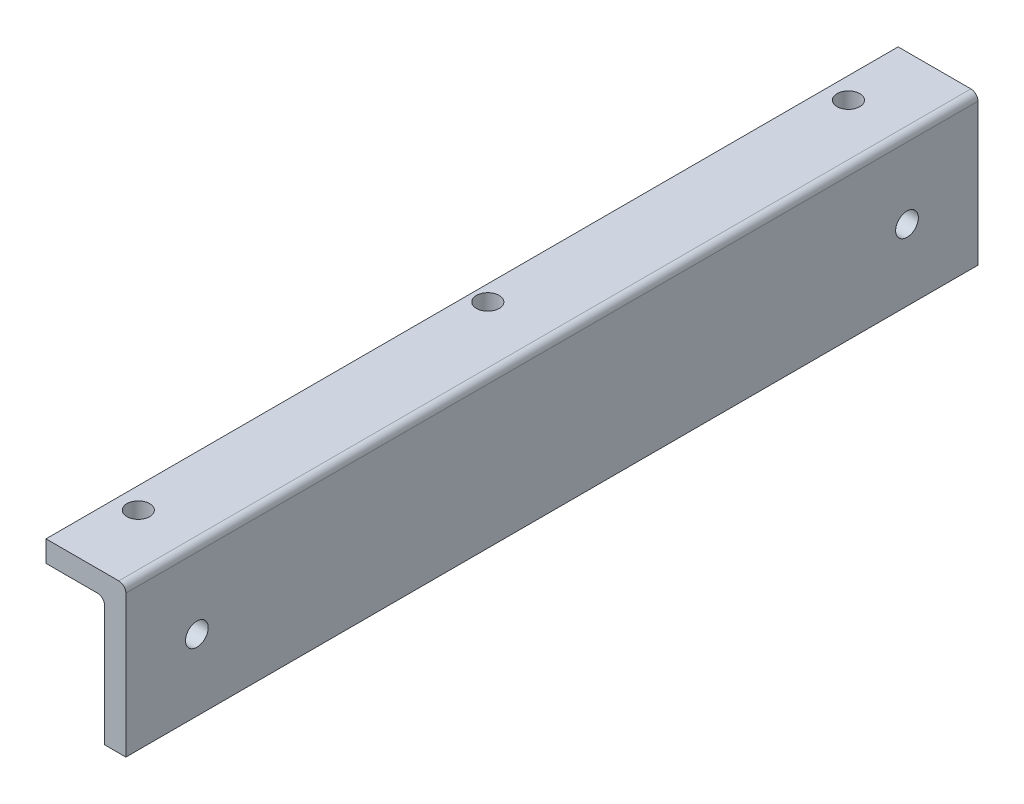
ISO-10303-21;
HEADER;
FILE_DESCRIPTION(('STEP AP214'),'2;1');
FILE_NAME('part.step','',(''),(''),'','','');
FILE_SCHEMA(('AUTOMOTIVE_DESIGN { 1 0 10303 214 1 1 1 1 }'));
ENDSEC;
DATA;
#1=APPLICATION_CONTEXT('core data for automotive mechanical design processes');
#2=APPLICATION_PROTOCOL_DEFINITION('international standard','automotive_design',2000,#1);
#3=PRODUCT_CONTEXT('',#1,'mechanical');
#4=PRODUCT('Part','Part','',(#3));
#5=PRODUCT_RELATED_PRODUCT_CATEGORY('part','',(#4));
#6=PRODUCT_DEFINITION_FORMATION('','',#4);
#7=PRODUCT_DEFINITION_CONTEXT('part definition',#1,'design');
#8=PRODUCT_DEFINITION('design','',#6,#7);
#9=PRODUCT_DEFINITION_SHAPE('','',#8);
#10=(LENGTH_UNIT() NAMED_UNIT(*) SI_UNIT(.MILLI.,.METRE.));
#11=(NAMED_UNIT(*) PLANE_ANGLE_UNIT() SI_UNIT($,.RADIAN.));
#12=(NAMED_UNIT(*) SI_UNIT($,.STERADIAN.) SOLID_ANGLE_UNIT());
#13=UNCERTAINTY_MEASURE_WITH_UNIT(LENGTH_MEASURE(1.E-05),#10,'distance_accuracy_value','');
#14=(GEOMETRIC_REPRESENTATION_CONTEXT(3) GLOBAL_UNCERTAINTY_ASSIGNED_CONTEXT((#13)) GLOBAL_UNIT_ASSIGNED_CONTEXT((#10,
#11,#12)) REPRESENTATION_CONTEXT('',''));
#15=CARTESIAN_POINT('',(0.,0.,0.));
#16=DIRECTION('',(0.,0.,1.));
#17=DIRECTION('',(1.,0.,0.));
#18=AXIS2_PLACEMENT_3D('',#15,#16,#17);
#19=CARTESIAN_POINT('',(-16.7448502616641,-0.762431653722327,60.));
#20=DIRECTION('',(0.,1.,0.));
#21=DIRECTION('',(0.,0.,1.));
#22=AXIS2_PLACEMENT_3D('',#19,#20,#21);
#23=PLANE('',#22);
#24=DIRECTION('',(1.,0.,0.));
#25=VECTOR('',#24,1.);
#26=CARTESIAN_POINT('',(-16.7448502616641,-0.762431653722327,-60.));
#27=LINE('',#26,#25);
#28=CARTESIAN_POINT('',(-16.7448502616641,-0.762431653722327,-60.));
#29=VERTEX_POINT('',#28);
#30=CARTESIAN_POINT('',(-13.7448502616641,-0.762431653722327,-60.));
#31=VERTEX_POINT('',#30);
#32=EDGE_CURVE('E137',#29,#31,#27,.T.);
#33=ORIENTED_EDGE('',*,*,#32,.T.);
#34=DIRECTION('',(0.,0.,-1.));
#35=VECTOR('',#34,1.);
#36=CARTESIAN_POINT('',(-13.7448502616641,-0.762431653722327,60.));
#37=LINE('',#36,#35);
#38=CARTESIAN_POINT('',(-13.7448502616641,-0.762431653722327,60.));
#39=VERTEX_POINT('',#38);
#40=EDGE_CURVE('E116',#39,#31,#37,.T.);
#41=ORIENTED_EDGE('',*,*,#40,.F.);
#42=DIRECTION('',(1.,0.,0.));
#43=VECTOR('',#42,1.);
#44=CARTESIAN_POINT('',(-16.7448502616641,-0.762431653722327,60.));
#45=LINE('',#44,#43);
#46=CARTESIAN_POINT('',(-16.7448502616641,-0.762431653722327,60.));
#47=VERTEX_POINT('',#46);
#48=EDGE_CURVE('E124',#47,#39,#45,.T.);
#49=ORIENTED_EDGE('',*,*,#48,.F.);
#50=DIRECTION('',(0.,0.,-1.));
#51=VECTOR('',#50,1.);
#52=CARTESIAN_POINT('',(-16.7448502616641,-0.762431653722327,60.));
#53=LINE('',#52,#51);
#54=EDGE_CURVE('E180',#47,#29,#53,.T.);
#55=ORIENTED_EDGE('',*,*,#54,.T.);
#56=EDGE_LOOP('',(#33,#41,#49,#55));
#57=FACE_BOUND('',#56,.T.);
#58=ADVANCED_FACE('F45',(#57),#23,.F.);
#59=CARTESIAN_POINT('',(-13.7448502616641,-0.762431653722327,60.));
#60=DIRECTION('',(-1.,0.,0.));
#61=DIRECTION('',(0.,0.,1.));
#62=AXIS2_PLACEMENT_3D('',#59,#60,#61);
#63=PLANE('',#62);
#64=CARTESIAN_POINT('',(-13.7448502616641,9.23756834627768,50.));
#65=DIRECTION('',(-1.,0.,0.));
#66=DIRECTION('',(0.,0.,1.));
#67=AXIS2_PLACEMENT_3D('',#64,#65,#66);
#68=CIRCLE('',#67,1.6);
#69=CARTESIAN_POINT('',(-13.7448502616641,9.23756834627768,51.6));
#70=VERTEX_POINT('',#69);
#71=EDGE_CURVE('E200',#70,#70,#68,.T.);
#72=ORIENTED_EDGE('',*,*,#71,.T.);
#73=EDGE_LOOP('',(#72));
#74=FACE_BOUND('',#73,.T.);
#75=CARTESIAN_POINT('',(-13.7448502616641,9.23756834627768,-50.));
#76=DIRECTION('',(-1.,0.,0.));
#77=DIRECTION('',(0.,0.,1.));
#78=AXIS2_PLACEMENT_3D('',#75,#76,#77);
#79=CIRCLE('',#78,1.6);
#80=CARTESIAN_POINT('',(-13.7448502616641,9.23756834627768,-48.4));
#81=VERTEX_POINT('',#80);
#82=EDGE_CURVE('E213',#81,#81,#79,.T.);
#83=ORIENTED_EDGE('',*,*,#82,.T.);
#84=EDGE_LOOP('',(#83));
#85=FACE_BOUND('',#84,.T.);
#86=DIRECTION('',(0.,1.,0.));
#87=VECTOR('',#86,1.);
#88=CARTESIAN_POINT('',(-13.7448502616641,-0.762431653722327,-60.));
#89=LINE('',#88,#87);
#90=CARTESIAN_POINT('',(-13.7448502616641,19.2375683462777,-60.));
#91=VERTEX_POINT('',#90);
#92=EDGE_CURVE('E193',#31,#91,#89,.T.);
#93=ORIENTED_EDGE('',*,*,#92,.T.);
#94=DIRECTION('',(0.,0.,-1.));
#95=VECTOR('',#94,1.);
#96=CARTESIAN_POINT('',(-13.7448502616641,19.2375683462777,60.));
#97=LINE('',#96,#95);
#98=CARTESIAN_POINT('',(-13.7448502616641,19.2375683462777,60.));
#99=VERTEX_POINT('',#98);
#100=EDGE_CURVE('E119',#91,#99,#97,.F.);
#101=ORIENTED_EDGE('',*,*,#100,.T.);
#102=DIRECTION('',(0.,1.,0.));
#103=VECTOR('',#102,1.);
#104=CARTESIAN_POINT('',(-13.7448502616641,-0.762431653722327,60.));
#105=LINE('',#104,#103);
#106=EDGE_CURVE('E111',#39,#99,#105,.T.);
#107=ORIENTED_EDGE('',*,*,#106,.F.);
#108=ORIENTED_EDGE('',*,*,#40,.T.);
#109=EDGE_LOOP('',(#93,#101,#107,#108));
#110=FACE_BOUND('',#109,.T.);
#111=ADVANCED_FACE('F114',(#74,#85,#110),#63,.F.);
#112=CARTESIAN_POINT('',(-13.7448502616641,20.2375683462777,60.));
#113=DIRECTION('',(0.,-1.,0.));
#114=DIRECTION('',(1.,0.,0.));
#115=AXIS2_PLACEMENT_3D('',#112,#113,#114);
#116=PLANE('',#115);
#117=CARTESIAN_POINT('',(-21.9948502616641,20.2375683462777,-50.));
#118=DIRECTION('',(0.,-1.,0.));
#119=DIRECTION('',(1.,0.,0.));
#120=AXIS2_PLACEMENT_3D('',#117,#118,#119);
#121=CIRCLE('',#120,1.6);
#122=CARTESIAN_POINT('',(-20.3948502616641,20.2375683462777,-50.));
#123=VERTEX_POINT('',#122);
#124=EDGE_CURVE('E222',#123,#123,#121,.T.);
#125=ORIENTED_EDGE('',*,*,#124,.T.);
#126=EDGE_LOOP('',(#125));
#127=FACE_BOUND('',#126,.T.);
#128=CARTESIAN_POINT('',(-21.9948502616641,20.2375683462777,50.));
#129=DIRECTION('',(0.,-1.,0.));
#130=DIRECTION('',(1.,0.,0.));
#131=AXIS2_PLACEMENT_3D('',#128,#129,#130);
#132=CIRCLE('',#131,1.6);
#133=CARTESIAN_POINT('',(-20.3948502616641,20.2375683462777,50.));
#134=VERTEX_POINT('',#133);
#135=EDGE_CURVE('E229',#134,#134,#132,.T.);
#136=ORIENTED_EDGE('',*,*,#135,.T.);
#137=EDGE_LOOP('',(#136));
#138=FACE_BOUND('',#137,.T.);
#139=CARTESIAN_POINT('',(-22.7777333050218,20.2375683462777,0.));
#140=DIRECTION('',(0.,-1.,0.));
#141=DIRECTION('',(1.,0.,0.));
#142=AXIS2_PLACEMENT_3D('',#139,#140,#141);
#143=CIRCLE('',#142,1.6);
#144=CARTESIAN_POINT('',(-21.1777333050218,20.2375683462777,0.));
#145=VERTEX_POINT('',#144);
#146=EDGE_CURVE('E233',#145,#145,#143,.T.);
#147=ORIENTED_EDGE('',*,*,#146,.T.);
#148=EDGE_LOOP('',(#147));
#149=FACE_BOUND('',#148,.T.);
#150=DIRECTION('',(-1.,0.,0.));
#151=VECTOR('',#150,1.);
#152=CARTESIAN_POINT('',(-13.7448502616641,20.2375683462777,60.));
#153=LINE('',#152,#151);
#154=CARTESIAN_POINT('',(-14.7448502616641,20.2375683462777,60.));
#155=VERTEX_POINT('',#154);
#156=CARTESIAN_POINT('',(-24.9948502616641,20.2375683462777,60.));
#157=VERTEX_POINT('',#156);
#158=EDGE_CURVE('E123',#155,#157,#153,.T.);
#159=ORIENTED_EDGE('',*,*,#158,.F.);
#160=DIRECTION('',(0.,0.,-1.));
#161=VECTOR('',#160,1.);
#162=CARTESIAN_POINT('',(-14.7448502616641,20.2375683462777,60.));
#163=LINE('',#162,#161);
#164=CARTESIAN_POINT('',(-14.7448502616641,20.2375683462777,-60.));
#165=VERTEX_POINT('',#164);
#166=EDGE_CURVE('E139',#155,#165,#163,.T.);
#167=ORIENTED_EDGE('',*,*,#166,.T.);
#168=DIRECTION('',(-1.,0.,0.));
#169=VECTOR('',#168,1.);
#170=CARTESIAN_POINT('',(-13.7448502616641,20.2375683462777,-60.));
#171=LINE('',#170,#169);
#172=CARTESIAN_POINT('',(-24.9948502616641,20.2375683462777,-60.));
#173=VERTEX_POINT('',#172);
#174=EDGE_CURVE('E190',#165,#173,#171,.T.);
#175=ORIENTED_EDGE('',*,*,#174,.T.);
#176=DIRECTION('',(0.,0.,-1.));
#177=VECTOR('',#176,1.);
#178=CARTESIAN_POINT('',(-24.9948502616641,20.2375683462777,60.));
#179=LINE('',#178,#177);
#180=EDGE_CURVE('E140',#157,#173,#179,.T.);
#181=ORIENTED_EDGE('',*,*,#180,.F.);
#182=EDGE_LOOP('',(#159,#167,#175,#181));
#183=FACE_BOUND('',#182,.T.);
#184=ADVANCED_FACE('F269',(#127,#138,#149,#183),#116,.F.);
#185=CARTESIAN_POINT('',(-24.9948502616641,20.2375683462777,60.));
#186=DIRECTION('',(1.,0.,0.));
#187=DIRECTION('',(0.,0.,-1.));
#188=AXIS2_PLACEMENT_3D('',#185,#186,#187);
#189=PLANE('',#188);
#190=DIRECTION('',(0.,-1.,0.));
#191=VECTOR('',#190,1.);
#192=CARTESIAN_POINT('',(-24.9948502616641,20.2375683462777,-60.));
#193=LINE('',#192,#191);
#194=CARTESIAN_POINT('',(-24.9948502616641,17.2375683462777,-60.));
#195=VERTEX_POINT('',#194);
#196=EDGE_CURVE('E176',#173,#195,#193,.T.);
#197=ORIENTED_EDGE('',*,*,#196,.T.);
#198=DIRECTION('',(0.,0.,-1.));
#199=VECTOR('',#198,1.);
#200=CARTESIAN_POINT('',(-24.9948502616641,17.2375683462777,60.));
#201=LINE('',#200,#199);
#202=CARTESIAN_POINT('',(-24.9948502616641,17.2375683462777,60.));
#203=VERTEX_POINT('',#202);
#204=EDGE_CURVE('E148',#203,#195,#201,.T.);
#205=ORIENTED_EDGE('',*,*,#204,.F.);
#206=DIRECTION('',(0.,-1.,0.));
#207=VECTOR('',#206,1.);
#208=CARTESIAN_POINT('',(-24.9948502616641,20.2375683462777,60.));
#209=LINE('',#208,#207);
#210=EDGE_CURVE('E205',#157,#203,#209,.T.);
#211=ORIENTED_EDGE('',*,*,#210,.F.);
#212=ORIENTED_EDGE('',*,*,#180,.T.);
#213=EDGE_LOOP('',(#197,#205,#211,#212));
#214=FACE_BOUND('',#213,.T.);
#215=ADVANCED_FACE('F255',(#214),#189,.F.);
#216=CARTESIAN_POINT('',(-24.9948502616641,17.2375683462777,60.));
#217=DIRECTION('',(0.,1.,0.));
#218=DIRECTION('',(0.,0.,1.));
#219=AXIS2_PLACEMENT_3D('',#216,#217,#218);
#220=PLANE('',#219);
#221=CARTESIAN_POINT('',(-21.9948502616641,17.2375683462777,-50.));
#222=DIRECTION('',(0.,-1.,0.));
#223=DIRECTION('',(0.,0.,-1.));
#224=AXIS2_PLACEMENT_3D('',#221,#222,#223);
#225=CIRCLE('',#224,1.6);
#226=CARTESIAN_POINT('',(-21.9948502616641,17.2375683462777,-51.6));
#227=VERTEX_POINT('',#226);
#228=EDGE_CURVE('E237',#227,#227,#225,.T.);
#229=ORIENTED_EDGE('',*,*,#228,.F.);
#230=EDGE_LOOP('',(#229));
#231=FACE_BOUND('',#230,.T.);
#232=CARTESIAN_POINT('',(-21.9948502616641,17.2375683462777,50.));
#233=DIRECTION('',(0.,-1.,0.));
#234=DIRECTION('',(0.,0.,-1.));
#235=AXIS2_PLACEMENT_3D('',#232,#233,#234);
#236=CIRCLE('',#235,1.6);
#237=CARTESIAN_POINT('',(-21.9948502616641,17.2375683462777,48.4));
#238=VERTEX_POINT('',#237);
#239=EDGE_CURVE('E242',#238,#238,#236,.T.);
#240=ORIENTED_EDGE('',*,*,#239,.F.);
#241=EDGE_LOOP('',(#240));
#242=FACE_BOUND('',#241,.T.);
#243=CARTESIAN_POINT('',(-22.7777333050218,17.2375683462777,0.));
#244=DIRECTION('',(0.,-1.,0.));
#245=DIRECTION('',(0.,0.,-1.));
#246=AXIS2_PLACEMENT_3D('',#243,#244,#245);
#247=CIRCLE('',#246,1.6);
#248=CARTESIAN_POINT('',(-22.7777333050218,17.2375683462777,-1.6));
#249=VERTEX_POINT('',#248);
#250=EDGE_CURVE('E238',#249,#249,#247,.T.);
#251=ORIENTED_EDGE('',*,*,#250,.F.);
#252=EDGE_LOOP('',(#251));
#253=FACE_BOUND('',#252,.T.);
#254=DIRECTION('',(1.,0.,0.));
#255=VECTOR('',#254,1.);
#256=CARTESIAN_POINT('',(-24.9948502616641,17.2375683462777,-60.));
#257=LINE('',#256,#255);
#258=CARTESIAN_POINT('',(-17.7448502616641,17.2375683462777,-60.));
#259=VERTEX_POINT('',#258);
#260=EDGE_CURVE('E173',#195,#259,#257,.T.);
#261=ORIENTED_EDGE('',*,*,#260,.T.);
#262=DIRECTION('',(0.,0.,-1.));
#263=VECTOR('',#262,1.);
#264=CARTESIAN_POINT('',(-17.7448502616641,17.2375683462777,60.));
#265=LINE('',#264,#263);
#266=CARTESIAN_POINT('',(-17.7448502616641,17.2375683462777,60.));
#267=VERTEX_POINT('',#266);
#268=EDGE_CURVE('E61',#259,#267,#265,.F.);
#269=ORIENTED_EDGE('',*,*,#268,.T.);
#270=DIRECTION('',(1.,0.,0.));
#271=VECTOR('',#270,1.);
#272=CARTESIAN_POINT('',(-24.9948502616641,17.2375683462777,60.));
#273=LINE('',#272,#271);
#274=EDGE_CURVE('E186',#203,#267,#273,.T.);
#275=ORIENTED_EDGE('',*,*,#274,.F.);
#276=ORIENTED_EDGE('',*,*,#204,.T.);
#277=EDGE_LOOP('',(#261,#269,#275,#276));
#278=FACE_BOUND('',#277,.T.);
#279=ADVANCED_FACE('F185',(#231,#242,#253,#278),#220,.F.);
#280=CARTESIAN_POINT('',(-16.7448502616641,17.2375683462777,60.));
#281=DIRECTION('',(1.,0.,0.));
#282=DIRECTION('',(0.,1.,0.));
#283=AXIS2_PLACEMENT_3D('',#280,#281,#282);
#284=PLANE('',#283);
#285=CARTESIAN_POINT('',(-16.7448502616641,9.23756834627768,50.));
#286=DIRECTION('',(-1.,0.,0.));
#287=DIRECTION('',(0.,-1.,0.));
#288=AXIS2_PLACEMENT_3D('',#285,#286,#287);
#289=CIRCLE('',#288,1.6);
#290=CARTESIAN_POINT('',(-16.7448502616641,7.63756834627769,50.));
#291=VERTEX_POINT('',#290);
#292=EDGE_CURVE('E217',#291,#291,#289,.T.);
#293=ORIENTED_EDGE('',*,*,#292,.F.);
#294=EDGE_LOOP('',(#293));
#295=FACE_BOUND('',#294,.T.);
#296=CARTESIAN_POINT('',(-16.7448502616641,9.23756834627768,-50.));
#297=DIRECTION('',(-1.,0.,0.));
#298=DIRECTION('',(0.,-1.,0.));
#299=AXIS2_PLACEMENT_3D('',#296,#297,#298);
#300=CIRCLE('',#299,1.6);
#301=CARTESIAN_POINT('',(-16.7448502616641,7.63756834627769,-50.));
#302=VERTEX_POINT('',#301);
#303=EDGE_CURVE('E218',#302,#302,#300,.T.);
#304=ORIENTED_EDGE('',*,*,#303,.F.);
#305=EDGE_LOOP('',(#304));
#306=FACE_BOUND('',#305,.T.);
#307=DIRECTION('',(0.,-1.,0.));
#308=VECTOR('',#307,1.);
#309=CARTESIAN_POINT('',(-16.7448502616641,17.2375683462777,60.));
#310=LINE('',#309,#308);
#311=CARTESIAN_POINT('',(-16.7448502616641,16.2375683462777,60.));
#312=VERTEX_POINT('',#311);
#313=EDGE_CURVE('E129',#312,#47,#310,.T.);
#314=ORIENTED_EDGE('',*,*,#313,.F.);
#315=DIRECTION('',(0.,0.,-1.));
#316=VECTOR('',#315,1.);
#317=CARTESIAN_POINT('',(-16.7448502616641,16.2375683462777,-60.));
#318=LINE('',#317,#316);
#319=CARTESIAN_POINT('',(-16.7448502616641,16.2375683462777,-60.));
#320=VERTEX_POINT('',#319);
#321=EDGE_CURVE('E159',#312,#320,#318,.T.);
#322=ORIENTED_EDGE('',*,*,#321,.T.);
#323=DIRECTION('',(0.,-1.,0.));
#324=VECTOR('',#323,1.);
#325=CARTESIAN_POINT('',(-16.7448502616641,17.2375683462777,-60.));
#326=LINE('',#325,#324);
#327=EDGE_CURVE('E134',#320,#29,#326,.T.);
#328=ORIENTED_EDGE('',*,*,#327,.T.);
#329=ORIENTED_EDGE('',*,*,#54,.F.);
#330=EDGE_LOOP('',(#314,#322,#328,#329));
#331=FACE_BOUND('',#330,.T.);
#332=ADVANCED_FACE('F167',(#295,#306,#331),#284,.F.);
#333=CARTESIAN_POINT('',(0.,0.,60.));
#334=DIRECTION('',(0.,0.,1.));
#335=DIRECTION('',(1.,0.,0.));
#336=AXIS2_PLACEMENT_3D('',#333,#334,#335);
#337=PLANE('',#336);
#338=ORIENTED_EDGE('',*,*,#106,.T.);
#339=CARTESIAN_POINT('',(-14.7448502616641,19.2375683462777,60.));
#340=DIRECTION('',(0.,0.,1.));
#341=DIRECTION('',(1.,0.,0.));
#342=AXIS2_PLACEMENT_3D('',#339,#340,#341);
#343=CIRCLE('',#342,1.);
#344=EDGE_CURVE('E156',#99,#155,#343,.T.);
#345=ORIENTED_EDGE('',*,*,#344,.T.);
#346=ORIENTED_EDGE('',*,*,#158,.T.);
#347=ORIENTED_EDGE('',*,*,#210,.T.);
#348=ORIENTED_EDGE('',*,*,#274,.T.);
#349=CARTESIAN_POINT('',(-17.7448502616641,16.2375683462777,60.));
#350=DIRECTION('',(0.,0.,1.));
#351=DIRECTION('',(1.,0.,0.));
#352=AXIS2_PLACEMENT_3D('',#349,#350,#351);
#353=CIRCLE('',#352,1.);
#354=EDGE_CURVE('E11',#267,#312,#353,.F.);
#355=ORIENTED_EDGE('',*,*,#354,.T.);
#356=ORIENTED_EDGE('',*,*,#313,.T.);
#357=ORIENTED_EDGE('',*,*,#48,.T.);
#358=EDGE_LOOP('',(#338,#345,#346,#347,#348,#355,#356,#357));
#359=FACE_BOUND('',#358,.T.);
#360=ADVANCED_FACE('F127',(#359),#337,.T.);
#361=CARTESIAN_POINT('',(0.,0.,-60.));
#362=DIRECTION('',(0.,0.,1.));
#363=DIRECTION('',(1.,0.,0.));
#364=AXIS2_PLACEMENT_3D('',#361,#362,#363);
#365=PLANE('',#364);
#366=ORIENTED_EDGE('',*,*,#174,.F.);
#367=CARTESIAN_POINT('',(-14.7448502616641,19.2375683462777,-60.));
#368=DIRECTION('',(0.,0.,1.));
#369=DIRECTION('',(1.,0.,0.));
#370=AXIS2_PLACEMENT_3D('',#367,#368,#369);
#371=CIRCLE('',#370,1.);
#372=EDGE_CURVE('E145',#165,#91,#371,.F.);
#373=ORIENTED_EDGE('',*,*,#372,.T.);
#374=ORIENTED_EDGE('',*,*,#92,.F.);
#375=ORIENTED_EDGE('',*,*,#32,.F.);
#376=ORIENTED_EDGE('',*,*,#327,.F.);
#377=CARTESIAN_POINT('',(-17.7448502616641,16.2375683462777,-60.));
#378=DIRECTION('',(0.,0.,1.));
#379=DIRECTION('',(1.,0.,0.));
#380=AXIS2_PLACEMENT_3D('',#377,#378,#379);
#381=CIRCLE('',#380,1.);
#382=EDGE_CURVE('E54',#320,#259,#381,.T.);
#383=ORIENTED_EDGE('',*,*,#382,.T.);
#384=ORIENTED_EDGE('',*,*,#260,.F.);
#385=ORIENTED_EDGE('',*,*,#196,.F.);
#386=EDGE_LOOP('',(#366,#373,#374,#375,#376,#383,#384,#385));
#387=FACE_BOUND('',#386,.T.);
#388=ADVANCED_FACE('F171',(#387),#365,.F.);
#389=CARTESIAN_POINT('',(-14.7448502616641,19.2375683462777,60.));
#390=DIRECTION('',(0.,0.,-1.));
#391=DIRECTION('',(-1.,0.,0.));
#392=AXIS2_PLACEMENT_3D('',#389,#390,#391);
#393=CYLINDRICAL_SURFACE('',#392,1.);
#394=ORIENTED_EDGE('',*,*,#344,.F.);
#395=ORIENTED_EDGE('',*,*,#100,.F.);
#396=ORIENTED_EDGE('',*,*,#372,.F.);
#397=ORIENTED_EDGE('',*,*,#166,.F.);
#398=EDGE_LOOP('',(#394,#395,#396,#397));
#399=FACE_BOUND('',#398,.T.);
#400=ADVANCED_FACE('F278',(#399),#393,.T.);
#401=CARTESIAN_POINT('',(-17.7448502616641,16.2375683462777,60.));
#402=DIRECTION('',(0.,0.,1.));
#403=DIRECTION('',(1.,0.,0.));
#404=AXIS2_PLACEMENT_3D('',#401,#402,#403);
#405=CYLINDRICAL_SURFACE('',#404,1.);
#406=ORIENTED_EDGE('',*,*,#354,.F.);
#407=ORIENTED_EDGE('',*,*,#268,.F.);
#408=ORIENTED_EDGE('',*,*,#382,.F.);
#409=ORIENTED_EDGE('',*,*,#321,.F.);
#410=EDGE_LOOP('',(#406,#407,#408,#409));
#411=FACE_BOUND('',#410,.T.);
#412=ADVANCED_FACE('F47',(#411),#405,.F.);
#413=CARTESIAN_POINT('',(-6.74485026166408,9.23756834627769,-50.));
#414=DIRECTION('',(-1.,0.,0.));
#415=DIRECTION('',(0.,-1.,0.));
#416=AXIS2_PLACEMENT_3D('',#413,#414,#415);
#417=CYLINDRICAL_SURFACE('',#416,1.6);
#418=ORIENTED_EDGE('',*,*,#303,.T.);
#419=EDGE_LOOP('',(#418));
#420=FACE_BOUND('',#419,.T.);
#421=ORIENTED_EDGE('',*,*,#82,.F.);
#422=EDGE_LOOP('',(#421));
#423=FACE_BOUND('',#422,.T.);
#424=ADVANCED_FACE('F285',(#420,#423),#417,.F.);
#425=CARTESIAN_POINT('',(-6.74485026166408,9.23756834627769,50.));
#426=DIRECTION('',(-1.,0.,0.));
#427=DIRECTION('',(0.,-1.,0.));
#428=AXIS2_PLACEMENT_3D('',#425,#426,#427);
#429=CYLINDRICAL_SURFACE('',#428,1.6);
#430=ORIENTED_EDGE('',*,*,#292,.T.);
#431=EDGE_LOOP('',(#430));
#432=FACE_BOUND('',#431,.T.);
#433=ORIENTED_EDGE('',*,*,#71,.F.);
#434=EDGE_LOOP('',(#433));
#435=FACE_BOUND('',#434,.T.);
#436=ADVANCED_FACE('F265',(#432,#435),#429,.F.);
#437=CARTESIAN_POINT('',(-22.7777333050218,27.2375683462777,0.));
#438=DIRECTION('',(0.,-1.,0.));
#439=DIRECTION('',(0.,0.,-1.));
#440=AXIS2_PLACEMENT_3D('',#437,#438,#439);
#441=CYLINDRICAL_SURFACE('',#440,1.6);
#442=ORIENTED_EDGE('',*,*,#250,.T.);
#443=EDGE_LOOP('',(#442));
#444=FACE_BOUND('',#443,.T.);
#445=ORIENTED_EDGE('',*,*,#146,.F.);
#446=EDGE_LOOP('',(#445));
#447=FACE_BOUND('',#446,.T.);
#448=ADVANCED_FACE('F261',(#444,#447),#441,.F.);
#449=CARTESIAN_POINT('',(-21.9948502616641,27.2375683462777,50.));
#450=DIRECTION('',(0.,-1.,0.));
#451=DIRECTION('',(0.,0.,-1.));
#452=AXIS2_PLACEMENT_3D('',#449,#450,#451);
#453=CYLINDRICAL_SURFACE('',#452,1.6);
#454=ORIENTED_EDGE('',*,*,#239,.T.);
#455=EDGE_LOOP('',(#454));
#456=FACE_BOUND('',#455,.T.);
#457=ORIENTED_EDGE('',*,*,#135,.F.);
#458=EDGE_LOOP('',(#457));
#459=FACE_BOUND('',#458,.T.);
#460=ADVANCED_FACE('F264',(#456,#459),#453,.F.);
#461=CARTESIAN_POINT('',(-21.9948502616641,27.2375683462777,-50.));
#462=DIRECTION('',(0.,-1.,0.));
#463=DIRECTION('',(0.,0.,-1.));
#464=AXIS2_PLACEMENT_3D('',#461,#462,#463);
#465=CYLINDRICAL_SURFACE('',#464,1.6);
#466=ORIENTED_EDGE('',*,*,#228,.T.);
#467=EDGE_LOOP('',(#466));
#468=FACE_BOUND('',#467,.T.);
#469=ORIENTED_EDGE('',*,*,#124,.F.);
#470=EDGE_LOOP('',(#469));
#471=FACE_BOUND('',#470,.T.);
#472=ADVANCED_FACE('F250',(#468,#471),#465,.F.);
#473=CLOSED_SHELL('',(#58,#111,#184,#215,#279,#332,#360,#388,#400,#412,#424,#436,#448,#460,#472));
#474=MANIFOLD_SOLID_BREP('B2',#473);
#475=ADVANCED_BREP_SHAPE_REPRESENTATION('',(#18,#474),#14);
#476=SHAPE_DEFINITION_REPRESENTATION(#9,#475);
ENDSEC;
END-ISO-10303-21;
